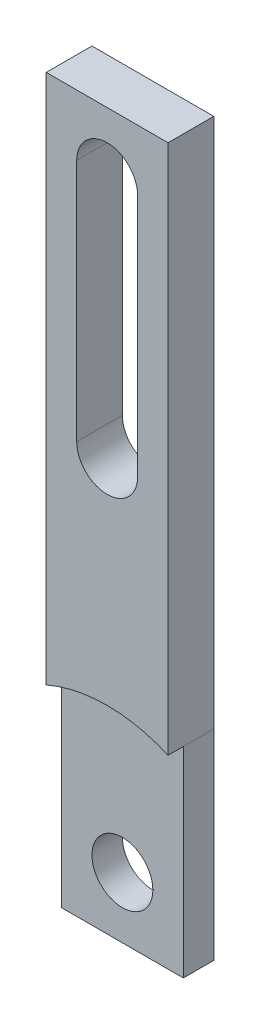
ISO-10303-21;
HEADER;
FILE_DESCRIPTION(('STEP AP214'),'2;1');
FILE_NAME('part.step','',(''),(''),'','','');
FILE_SCHEMA(('AUTOMOTIVE_DESIGN { 1 0 10303 214 1 1 1 1 }'));
ENDSEC;
DATA;
#1=APPLICATION_CONTEXT('core data for automotive mechanical design processes');
#2=APPLICATION_PROTOCOL_DEFINITION('international standard','automotive_design',2000,#1);
#3=PRODUCT_CONTEXT('',#1,'mechanical');
#4=PRODUCT('Part','Part','',(#3));
#5=PRODUCT_RELATED_PRODUCT_CATEGORY('part','',(#4));
#6=PRODUCT_DEFINITION_FORMATION('','',#4);
#7=PRODUCT_DEFINITION_CONTEXT('part definition',#1,'design');
#8=PRODUCT_DEFINITION('design','',#6,#7);
#9=PRODUCT_DEFINITION_SHAPE('','',#8);
#10=(LENGTH_UNIT() NAMED_UNIT(*) SI_UNIT(.MILLI.,.METRE.));
#11=(NAMED_UNIT(*) PLANE_ANGLE_UNIT() SI_UNIT($,.RADIAN.));
#12=(NAMED_UNIT(*) SI_UNIT($,.STERADIAN.) SOLID_ANGLE_UNIT());
#13=UNCERTAINTY_MEASURE_WITH_UNIT(LENGTH_MEASURE(1.E-05),#10,'distance_accuracy_value','');
#14=(GEOMETRIC_REPRESENTATION_CONTEXT(3) GLOBAL_UNCERTAINTY_ASSIGNED_CONTEXT((#13)) GLOBAL_UNIT_ASSIGNED_CONTEXT((#10,
#11,#12)) REPRESENTATION_CONTEXT('',''));
#15=CARTESIAN_POINT('',(0.,0.,0.));
#16=DIRECTION('',(0.,0.,1.));
#17=DIRECTION('',(1.,0.,0.));
#18=AXIS2_PLACEMENT_3D('',#15,#16,#17);
#19=CARTESIAN_POINT('',(0.,-66.6554384955217,-5.));
#20=DIRECTION('',(0.,0.,1.));
#21=DIRECTION('',(1.,0.,0.));
#22=AXIS2_PLACEMENT_3D('',#19,#20,#21);
#23=CYLINDRICAL_SURFACE('',#22,49.9581167848633);
#24=DIRECTION('',(0.,0.,1.));
#25=VECTOR('',#24,1.);
#26=CARTESIAN_POINT('',(20.,-20.8753835295211,-5.));
#27=LINE('',#26,#25);
#28=CARTESIAN_POINT('',(20.,-20.8753835295211,-5.));
#29=VERTEX_POINT('',#28);
#30=CARTESIAN_POINT('',(20.,-20.8753835295211,10.));
#31=VERTEX_POINT('',#30);
#32=EDGE_CURVE('E171',#29,#31,#27,.T.);
#33=ORIENTED_EDGE('',*,*,#32,.T.);
#34=CARTESIAN_POINT('',(0.,-66.6554384955217,10.));
#35=DIRECTION('',(0.,0.,1.));
#36=DIRECTION('',(1.,0.,0.));
#37=AXIS2_PLACEMENT_3D('',#34,#35,#36);
#38=CIRCLE('',#37,49.9581167848633);
#39=CARTESIAN_POINT('',(-20.,-20.8753835295211,10.));
#40=VERTEX_POINT('',#39);
#41=EDGE_CURVE('E142',#31,#40,#38,.T.);
#42=ORIENTED_EDGE('',*,*,#41,.T.);
#43=DIRECTION('',(0.,0.,1.));
#44=VECTOR('',#43,1.);
#45=CARTESIAN_POINT('',(-20.,-20.8753835295211,-5.));
#46=LINE('',#45,#44);
#47=CARTESIAN_POINT('',(-20.,-20.8753835295211,-5.));
#48=VERTEX_POINT('',#47);
#49=EDGE_CURVE('E12',#48,#40,#46,.T.);
#50=ORIENTED_EDGE('',*,*,#49,.F.);
#51=CARTESIAN_POINT('',(0.,-66.6554384955217,-5.));
#52=DIRECTION('',(0.,0.,1.));
#53=DIRECTION('',(1.,0.,0.));
#54=AXIS2_PLACEMENT_3D('',#51,#52,#53);
#55=CIRCLE('',#54,49.9581167848633);
#56=EDGE_CURVE('E165',#29,#48,#55,.T.);
#57=ORIENTED_EDGE('',*,*,#56,.F.);
#58=EDGE_LOOP('',(#33,#42,#50,#57));
#59=FACE_BOUND('',#58,.T.);
#60=ADVANCED_FACE('F51',(#59),#23,.F.);
#61=CARTESIAN_POINT('',(-20.,0.,-5.));
#62=DIRECTION('',(1.,0.,0.));
#63=DIRECTION('',(0.,0.,-1.));
#64=AXIS2_PLACEMENT_3D('',#61,#62,#63);
#65=PLANE('',#64);
#66=ORIENTED_EDGE('',*,*,#49,.T.);
#67=DIRECTION('',(0.,1.,0.));
#68=VECTOR('',#67,1.);
#69=CARTESIAN_POINT('',(-20.,0.,10.));
#70=LINE('',#69,#68);
#71=CARTESIAN_POINT('',(-20.,153.29885952092,10.));
#72=VERTEX_POINT('',#71);
#73=EDGE_CURVE('E151',#40,#72,#70,.T.);
#74=ORIENTED_EDGE('',*,*,#73,.T.);
#75=DIRECTION('',(0.,0.,1.));
#76=VECTOR('',#75,1.);
#77=CARTESIAN_POINT('',(-20.,153.29885952092,-5.));
#78=LINE('',#77,#76);
#79=CARTESIAN_POINT('',(-20.,153.29885952092,-5.));
#80=VERTEX_POINT('',#79);
#81=EDGE_CURVE('E58',#80,#72,#78,.T.);
#82=ORIENTED_EDGE('',*,*,#81,.F.);
#83=DIRECTION('',(0.,1.,0.));
#84=VECTOR('',#83,1.);
#85=CARTESIAN_POINT('',(-20.,0.,-5.));
#86=LINE('',#85,#84);
#87=EDGE_CURVE('E66',#48,#80,#86,.T.);
#88=ORIENTED_EDGE('',*,*,#87,.F.);
#89=EDGE_LOOP('',(#66,#74,#82,#88));
#90=FACE_BOUND('',#89,.T.);
#91=ADVANCED_FACE('F198',(#90),#65,.F.);
#92=CARTESIAN_POINT('',(0.,153.29885952092,-5.));
#93=DIRECTION('',(0.,1.,0.));
#94=DIRECTION('',(0.,0.,1.));
#95=AXIS2_PLACEMENT_3D('',#92,#93,#94);
#96=PLANE('',#95);
#97=ORIENTED_EDGE('',*,*,#81,.T.);
#98=DIRECTION('',(-1.,0.,0.));
#99=VECTOR('',#98,1.);
#100=CARTESIAN_POINT('',(0.,153.29885952092,10.));
#101=LINE('',#100,#99);
#102=CARTESIAN_POINT('',(20.,153.29885952092,10.));
#103=VERTEX_POINT('',#102);
#104=EDGE_CURVE('E146',#103,#72,#101,.T.);
#105=ORIENTED_EDGE('',*,*,#104,.F.);
#106=DIRECTION('',(0.,0.,1.));
#107=VECTOR('',#106,1.);
#108=CARTESIAN_POINT('',(20.,153.29885952092,-5.));
#109=LINE('',#108,#107);
#110=CARTESIAN_POINT('',(20.,153.29885952092,-5.));
#111=VERTEX_POINT('',#110);
#112=EDGE_CURVE('E175',#111,#103,#109,.T.);
#113=ORIENTED_EDGE('',*,*,#112,.F.);
#114=DIRECTION('',(-1.,0.,0.));
#115=VECTOR('',#114,1.);
#116=CARTESIAN_POINT('',(0.,153.29885952092,-5.));
#117=LINE('',#116,#115);
#118=EDGE_CURVE('E170',#111,#80,#117,.T.);
#119=ORIENTED_EDGE('',*,*,#118,.T.);
#120=EDGE_LOOP('',(#97,#105,#113,#119));
#121=FACE_BOUND('',#120,.T.);
#122=ADVANCED_FACE('F199',(#121),#96,.T.);
#123=CARTESIAN_POINT('',(-9.99999999999998,0.,-5.));
#124=DIRECTION('',(-1.,0.,0.));
#125=DIRECTION('',(0.,-1.,0.));
#126=AXIS2_PLACEMENT_3D('',#123,#124,#125);
#127=PLANE('',#126);
#128=DIRECTION('',(0.,0.,1.));
#129=VECTOR('',#128,1.);
#130=CARTESIAN_POINT('',(-10.,133.298859520921,-5.));
#131=LINE('',#130,#129);
#132=CARTESIAN_POINT('',(-10.,133.298859520921,-5.));
#133=VERTEX_POINT('',#132);
#134=CARTESIAN_POINT('',(-10.,133.298859520921,10.));
#135=VERTEX_POINT('',#134);
#136=EDGE_CURVE('E54',#133,#135,#131,.T.);
#137=ORIENTED_EDGE('',*,*,#136,.T.);
#138=DIRECTION('',(0.,-1.,0.));
#139=VECTOR('',#138,1.);
#140=CARTESIAN_POINT('',(-9.99999999999998,0.,10.));
#141=LINE('',#140,#139);
#142=CARTESIAN_POINT('',(-9.99999999999999,53.2988595209205,10.));
#143=VERTEX_POINT('',#142);
#144=EDGE_CURVE('E119',#135,#143,#141,.T.);
#145=ORIENTED_EDGE('',*,*,#144,.T.);
#146=DIRECTION('',(0.,0.,1.));
#147=VECTOR('',#146,1.);
#148=CARTESIAN_POINT('',(-9.99999999999999,53.2988595209205,-5.));
#149=LINE('',#148,#147);
#150=CARTESIAN_POINT('',(-9.99999999999999,53.2988595209205,-5.));
#151=VERTEX_POINT('',#150);
#152=EDGE_CURVE('E179',#151,#143,#149,.T.);
#153=ORIENTED_EDGE('',*,*,#152,.F.);
#154=DIRECTION('',(0.,-1.,0.));
#155=VECTOR('',#154,1.);
#156=CARTESIAN_POINT('',(-9.99999999999998,0.,-5.));
#157=LINE('',#156,#155);
#158=EDGE_CURVE('E124',#133,#151,#157,.T.);
#159=ORIENTED_EDGE('',*,*,#158,.F.);
#160=EDGE_LOOP('',(#137,#145,#153,#159));
#161=FACE_BOUND('',#160,.T.);
#162=ADVANCED_FACE('F52',(#161),#127,.F.);
#163=CARTESIAN_POINT('',(0.,53.2988595209205,-5.));
#164=DIRECTION('',(0.,0.,1.));
#165=DIRECTION('',(1.,0.,0.));
#166=AXIS2_PLACEMENT_3D('',#163,#164,#165);
#167=CYLINDRICAL_SURFACE('',#166,10.);
#168=ORIENTED_EDGE('',*,*,#152,.T.);
#169=CARTESIAN_POINT('',(0.,53.2988595209205,10.));
#170=DIRECTION('',(0.,0.,1.));
#171=DIRECTION('',(1.,0.,0.));
#172=AXIS2_PLACEMENT_3D('',#169,#170,#171);
#173=CIRCLE('',#172,10.);
#174=CARTESIAN_POINT('',(10.,53.2988595209205,10.));
#175=VERTEX_POINT('',#174);
#176=EDGE_CURVE('E134',#143,#175,#173,.T.);
#177=ORIENTED_EDGE('',*,*,#176,.T.);
#178=DIRECTION('',(0.,0.,1.));
#179=VECTOR('',#178,1.);
#180=CARTESIAN_POINT('',(10.,53.2988595209205,-5.));
#181=LINE('',#180,#179);
#182=CARTESIAN_POINT('',(10.,53.2988595209205,-5.));
#183=VERTEX_POINT('',#182);
#184=EDGE_CURVE('E180',#183,#175,#181,.T.);
#185=ORIENTED_EDGE('',*,*,#184,.F.);
#186=CARTESIAN_POINT('',(0.,53.2988595209205,-5.));
#187=DIRECTION('',(0.,0.,1.));
#188=DIRECTION('',(1.,0.,0.));
#189=AXIS2_PLACEMENT_3D('',#186,#187,#188);
#190=CIRCLE('',#189,10.);
#191=EDGE_CURVE('E159',#151,#183,#190,.T.);
#192=ORIENTED_EDGE('',*,*,#191,.F.);
#193=EDGE_LOOP('',(#168,#177,#185,#192));
#194=FACE_BOUND('',#193,.T.);
#195=ADVANCED_FACE('F184',(#194),#167,.F.);
#196=CARTESIAN_POINT('',(10.,0.,-5.));
#197=DIRECTION('',(-1.,0.,0.));
#198=DIRECTION('',(0.,0.,1.));
#199=AXIS2_PLACEMENT_3D('',#196,#197,#198);
#200=PLANE('',#199);
#201=ORIENTED_EDGE('',*,*,#184,.T.);
#202=DIRECTION('',(0.,-1.,0.));
#203=VECTOR('',#202,1.);
#204=CARTESIAN_POINT('',(10.,0.,10.));
#205=LINE('',#204,#203);
#206=CARTESIAN_POINT('',(10.,133.298859520921,10.));
#207=VERTEX_POINT('',#206);
#208=EDGE_CURVE('E136',#207,#175,#205,.T.);
#209=ORIENTED_EDGE('',*,*,#208,.F.);
#210=DIRECTION('',(0.,0.,1.));
#211=VECTOR('',#210,1.);
#212=CARTESIAN_POINT('',(10.,133.298859520921,-5.));
#213=LINE('',#212,#211);
#214=CARTESIAN_POINT('',(10.,133.298859520921,-5.));
#215=VERTEX_POINT('',#214);
#216=EDGE_CURVE('E122',#215,#207,#213,.T.);
#217=ORIENTED_EDGE('',*,*,#216,.F.);
#218=DIRECTION('',(0.,-1.,0.));
#219=VECTOR('',#218,1.);
#220=CARTESIAN_POINT('',(10.,0.,-5.));
#221=LINE('',#220,#219);
#222=EDGE_CURVE('E160',#215,#183,#221,.T.);
#223=ORIENTED_EDGE('',*,*,#222,.T.);
#224=EDGE_LOOP('',(#201,#209,#217,#223));
#225=FACE_BOUND('',#224,.T.);
#226=ADVANCED_FACE('F182',(#225),#200,.T.);
#227=CARTESIAN_POINT('',(0.,133.298859520921,-5.));
#228=DIRECTION('',(0.,0.,1.));
#229=DIRECTION('',(1.,0.,0.));
#230=AXIS2_PLACEMENT_3D('',#227,#228,#229);
#231=CYLINDRICAL_SURFACE('',#230,10.);
#232=ORIENTED_EDGE('',*,*,#216,.T.);
#233=CARTESIAN_POINT('',(0.,133.298859520921,10.));
#234=DIRECTION('',(0.,0.,1.));
#235=DIRECTION('',(1.,0.,0.));
#236=AXIS2_PLACEMENT_3D('',#233,#234,#235);
#237=CIRCLE('',#236,10.);
#238=EDGE_CURVE('E132',#207,#135,#237,.T.);
#239=ORIENTED_EDGE('',*,*,#238,.T.);
#240=ORIENTED_EDGE('',*,*,#136,.F.);
#241=CARTESIAN_POINT('',(0.,133.298859520921,-5.));
#242=DIRECTION('',(0.,0.,1.));
#243=DIRECTION('',(1.,0.,0.));
#244=AXIS2_PLACEMENT_3D('',#241,#242,#243);
#245=CIRCLE('',#244,10.);
#246=EDGE_CURVE('E154',#215,#133,#245,.T.);
#247=ORIENTED_EDGE('',*,*,#246,.F.);
#248=EDGE_LOOP('',(#232,#239,#240,#247));
#249=FACE_BOUND('',#248,.T.);
#250=ADVANCED_FACE('F133',(#249),#231,.F.);
#251=CARTESIAN_POINT('',(20.,0.,-5.));
#252=DIRECTION('',(1.,0.,0.));
#253=DIRECTION('',(0.,0.,-1.));
#254=AXIS2_PLACEMENT_3D('',#251,#252,#253);
#255=PLANE('',#254);
#256=ORIENTED_EDGE('',*,*,#112,.T.);
#257=DIRECTION('',(0.,1.,0.));
#258=VECTOR('',#257,1.);
#259=CARTESIAN_POINT('',(20.,0.,10.));
#260=LINE('',#259,#258);
#261=EDGE_CURVE('E144',#31,#103,#260,.T.);
#262=ORIENTED_EDGE('',*,*,#261,.F.);
#263=ORIENTED_EDGE('',*,*,#32,.F.);
#264=DIRECTION('',(0.,1.,0.));
#265=VECTOR('',#264,1.);
#266=CARTESIAN_POINT('',(20.,0.,-5.));
#267=LINE('',#266,#265);
#268=EDGE_CURVE('E163',#29,#111,#267,.T.);
#269=ORIENTED_EDGE('',*,*,#268,.T.);
#270=EDGE_LOOP('',(#256,#262,#263,#269));
#271=FACE_BOUND('',#270,.T.);
#272=ADVANCED_FACE('F189',(#271),#255,.T.);
#273=CARTESIAN_POINT('',(0.,0.,-5.));
#274=DIRECTION('',(0.,0.,1.));
#275=DIRECTION('',(1.,0.,0.));
#276=AXIS2_PLACEMENT_3D('',#273,#274,#275);
#277=PLANE('',#276);
#278=ORIENTED_EDGE('',*,*,#158,.T.);
#279=ORIENTED_EDGE('',*,*,#191,.T.);
#280=ORIENTED_EDGE('',*,*,#222,.F.);
#281=ORIENTED_EDGE('',*,*,#246,.T.);
#282=EDGE_LOOP('',(#278,#279,#280,#281));
#283=FACE_BOUND('',#282,.T.);
#284=ORIENTED_EDGE('',*,*,#56,.T.);
#285=ORIENTED_EDGE('',*,*,#87,.T.);
#286=ORIENTED_EDGE('',*,*,#118,.F.);
#287=ORIENTED_EDGE('',*,*,#268,.F.);
#288=EDGE_LOOP('',(#284,#285,#286,#287));
#289=FACE_BOUND('',#288,.T.);
#290=ADVANCED_FACE('F187',(#283,#289),#277,.F.);
#291=CARTESIAN_POINT('',(0.,0.,10.));
#292=DIRECTION('',(0.,0.,1.));
#293=DIRECTION('',(1.,0.,0.));
#294=AXIS2_PLACEMENT_3D('',#291,#292,#293);
#295=PLANE('',#294);
#296=ORIENTED_EDGE('',*,*,#144,.F.);
#297=ORIENTED_EDGE('',*,*,#238,.F.);
#298=ORIENTED_EDGE('',*,*,#208,.T.);
#299=ORIENTED_EDGE('',*,*,#176,.F.);
#300=EDGE_LOOP('',(#296,#297,#298,#299));
#301=FACE_BOUND('',#300,.T.);
#302=ORIENTED_EDGE('',*,*,#41,.F.);
#303=ORIENTED_EDGE('',*,*,#261,.T.);
#304=ORIENTED_EDGE('',*,*,#104,.T.);
#305=ORIENTED_EDGE('',*,*,#73,.F.);
#306=EDGE_LOOP('',(#302,#303,#304,#305));
#307=FACE_BOUND('',#306,.T.);
#308=ADVANCED_FACE('F126',(#301,#307),#295,.T.);
#309=CLOSED_SHELL('',(#60,#91,#122,#162,#195,#226,#250,#272,#290,#308));
#310=MANIFOLD_SOLID_BREP('B2',#309);
#311=CARTESIAN_POINT('',(-20.,-86.7011404790795,-5.));
#312=DIRECTION('',(-1.,0.,0.));
#313=DIRECTION('',(0.,0.,1.));
#314=AXIS2_PLACEMENT_3D('',#311,#312,#313);
#315=PLANE('',#314);
#316=DIRECTION('',(0.,0.,1.));
#317=VECTOR('',#316,1.);
#318=CARTESIAN_POINT('',(-20.,-86.7011404790795,-5.));
#319=LINE('',#318,#317);
#320=CARTESIAN_POINT('',(-20.,-86.7011404790795,-5.));
#321=VERTEX_POINT('',#320);
#322=CARTESIAN_POINT('',(-20.,-86.7011404790795,5.));
#323=VERTEX_POINT('',#322);
#324=EDGE_CURVE('E287',#321,#323,#319,.T.);
#325=ORIENTED_EDGE('',*,*,#324,.T.);
#326=DIRECTION('',(0.,-1.,0.));
#327=VECTOR('',#326,1.);
#328=CARTESIAN_POINT('',(-20.,-86.7011404790795,5.));
#329=LINE('',#328,#327);
#330=CARTESIAN_POINT('',(-20.,-20.8753835295211,5.));
#331=VERTEX_POINT('',#330);
#332=EDGE_CURVE('E330',#331,#323,#329,.T.);
#333=ORIENTED_EDGE('',*,*,#332,.F.);
#334=DIRECTION('',(0.,0.,1.));
#335=VECTOR('',#334,1.);
#336=CARTESIAN_POINT('',(-20.,-20.8753835295211,-5.));
#337=LINE('',#336,#335);
#338=CARTESIAN_POINT('',(-20.,-20.8753835295211,-5.));
#339=VERTEX_POINT('',#338);
#340=EDGE_CURVE('E47',#339,#331,#337,.T.);
#341=ORIENTED_EDGE('',*,*,#340,.F.);
#342=DIRECTION('',(0.,-1.,0.));
#343=VECTOR('',#342,1.);
#344=CARTESIAN_POINT('',(-20.,-86.7011404790795,-5.));
#345=LINE('',#344,#343);
#346=EDGE_CURVE('E327',#339,#321,#345,.T.);
#347=ORIENTED_EDGE('',*,*,#346,.T.);
#348=EDGE_LOOP('',(#325,#333,#341,#347));
#349=FACE_BOUND('',#348,.T.);
#350=ADVANCED_FACE('F286',(#349),#315,.T.);
#351=CARTESIAN_POINT('',(0.,-66.7011404790795,-5.));
#352=DIRECTION('',(0.,0.,1.));
#353=DIRECTION('',(1.,0.,0.));
#354=AXIS2_PLACEMENT_3D('',#351,#352,#353);
#355=CYLINDRICAL_SURFACE('',#354,50.);
#356=ORIENTED_EDGE('',*,*,#340,.T.);
#357=CARTESIAN_POINT('',(0.,-66.7011404790795,5.));
#358=DIRECTION('',(0.,0.,1.));
#359=DIRECTION('',(1.,0.,0.));
#360=AXIS2_PLACEMENT_3D('',#357,#358,#359);
#361=CIRCLE('',#360,50.);
#362=CARTESIAN_POINT('',(20.,-20.8753835295211,5.));
#363=VERTEX_POINT('',#362);
#364=EDGE_CURVE('E342',#363,#331,#361,.T.);
#365=ORIENTED_EDGE('',*,*,#364,.F.);
#366=DIRECTION('',(0.,0.,1.));
#367=VECTOR('',#366,1.);
#368=CARTESIAN_POINT('',(20.,-20.8753835295211,-5.));
#369=LINE('',#368,#367);
#370=CARTESIAN_POINT('',(20.,-20.8753835295211,-5.));
#371=VERTEX_POINT('',#370);
#372=EDGE_CURVE('E293',#371,#363,#369,.T.);
#373=ORIENTED_EDGE('',*,*,#372,.F.);
#374=CARTESIAN_POINT('',(0.,-66.7011404790795,-5.));
#375=DIRECTION('',(0.,0.,1.));
#376=DIRECTION('',(1.,0.,0.));
#377=AXIS2_PLACEMENT_3D('',#374,#375,#376);
#378=CIRCLE('',#377,50.);
#379=EDGE_CURVE('E334',#371,#339,#378,.T.);
#380=ORIENTED_EDGE('',*,*,#379,.T.);
#381=EDGE_LOOP('',(#356,#365,#373,#380));
#382=FACE_BOUND('',#381,.T.);
#383=ADVANCED_FACE('F368',(#382),#355,.T.);
#384=CARTESIAN_POINT('',(20.,-86.7011404790795,-5.));
#385=DIRECTION('',(1.,0.,0.));
#386=DIRECTION('',(0.,0.,-1.));
#387=AXIS2_PLACEMENT_3D('',#384,#385,#386);
#388=PLANE('',#387);
#389=ORIENTED_EDGE('',*,*,#372,.T.);
#390=DIRECTION('',(0.,1.,0.));
#391=VECTOR('',#390,1.);
#392=CARTESIAN_POINT('',(20.,-86.7011404790795,5.));
#393=LINE('',#392,#391);
#394=CARTESIAN_POINT('',(20.,-86.7011404790795,5.));
#395=VERTEX_POINT('',#394);
#396=EDGE_CURVE('E338',#395,#363,#393,.T.);
#397=ORIENTED_EDGE('',*,*,#396,.F.);
#398=DIRECTION('',(0.,0.,1.));
#399=VECTOR('',#398,1.);
#400=CARTESIAN_POINT('',(20.,-86.7011404790795,-5.));
#401=LINE('',#400,#399);
#402=CARTESIAN_POINT('',(20.,-86.7011404790795,-5.));
#403=VERTEX_POINT('',#402);
#404=EDGE_CURVE('E335',#403,#395,#401,.T.);
#405=ORIENTED_EDGE('',*,*,#404,.F.);
#406=DIRECTION('',(0.,1.,0.));
#407=VECTOR('',#406,1.);
#408=CARTESIAN_POINT('',(20.,-86.7011404790795,-5.));
#409=LINE('',#408,#407);
#410=EDGE_CURVE('E358',#403,#371,#409,.T.);
#411=ORIENTED_EDGE('',*,*,#410,.T.);
#412=EDGE_LOOP('',(#389,#397,#405,#411));
#413=FACE_BOUND('',#412,.T.);
#414=ADVANCED_FACE('F361',(#413),#388,.T.);
#415=CARTESIAN_POINT('',(-20.,-86.7011404790795,-5.));
#416=DIRECTION('',(0.,-1.,0.));
#417=DIRECTION('',(0.,0.,-1.));
#418=AXIS2_PLACEMENT_3D('',#415,#416,#417);
#419=PLANE('',#418);
#420=ORIENTED_EDGE('',*,*,#404,.T.);
#421=DIRECTION('',(1.,0.,0.));
#422=VECTOR('',#421,1.);
#423=CARTESIAN_POINT('',(-20.,-86.7011404790795,5.));
#424=LINE('',#423,#422);
#425=EDGE_CURVE('E333',#323,#395,#424,.T.);
#426=ORIENTED_EDGE('',*,*,#425,.F.);
#427=ORIENTED_EDGE('',*,*,#324,.F.);
#428=DIRECTION('',(1.,0.,0.));
#429=VECTOR('',#428,1.);
#430=CARTESIAN_POINT('',(-20.,-86.7011404790795,-5.));
#431=LINE('',#430,#429);
#432=EDGE_CURVE('E356',#321,#403,#431,.T.);
#433=ORIENTED_EDGE('',*,*,#432,.T.);
#434=EDGE_LOOP('',(#420,#426,#427,#433));
#435=FACE_BOUND('',#434,.T.);
#436=ADVANCED_FACE('F337',(#435),#419,.T.);
#437=CARTESIAN_POINT('',(0.,-66.7011404790795,-5.));
#438=DIRECTION('',(0.,0.,1.));
#439=DIRECTION('',(1.,0.,0.));
#440=AXIS2_PLACEMENT_3D('',#437,#438,#439);
#441=PLANE('',#440);
#442=CARTESIAN_POINT('',(0.,-66.7011404790795,-5.));
#443=DIRECTION('',(0.,0.,1.));
#444=DIRECTION('',(1.,0.,0.));
#445=AXIS2_PLACEMENT_3D('',#442,#443,#444);
#446=CIRCLE('',#445,10.);
#447=CARTESIAN_POINT('',(10.,-66.7011404790795,-5.));
#448=VERTEX_POINT('',#447);
#449=EDGE_CURVE('E354',#448,#448,#446,.T.);
#450=ORIENTED_EDGE('',*,*,#449,.T.);
#451=EDGE_LOOP('',(#450));
#452=FACE_BOUND('',#451,.T.);
#453=ORIENTED_EDGE('',*,*,#346,.F.);
#454=ORIENTED_EDGE('',*,*,#379,.F.);
#455=ORIENTED_EDGE('',*,*,#410,.F.);
#456=ORIENTED_EDGE('',*,*,#432,.F.);
#457=EDGE_LOOP('',(#453,#454,#455,#456));
#458=FACE_BOUND('',#457,.T.);
#459=ADVANCED_FACE('F366',(#452,#458),#441,.F.);
#460=CARTESIAN_POINT('',(0.,-66.7011404790795,-5.));
#461=DIRECTION('',(0.,0.,1.));
#462=DIRECTION('',(1.,0.,0.));
#463=AXIS2_PLACEMENT_3D('',#460,#461,#462);
#464=CYLINDRICAL_SURFACE('',#463,10.);
#465=ORIENTED_EDGE('',*,*,#449,.F.);
#466=EDGE_LOOP('',(#465));
#467=FACE_BOUND('',#466,.T.);
#468=CARTESIAN_POINT('',(0.,-66.7011404790795,5.));
#469=DIRECTION('',(0.,0.,1.));
#470=DIRECTION('',(1.,0.,0.));
#471=AXIS2_PLACEMENT_3D('',#468,#469,#470);
#472=CIRCLE('',#471,10.);
#473=CARTESIAN_POINT('',(10.,-66.7011404790795,5.));
#474=VERTEX_POINT('',#473);
#475=EDGE_CURVE('E347',#474,#474,#472,.T.);
#476=ORIENTED_EDGE('',*,*,#475,.T.);
#477=EDGE_LOOP('',(#476));
#478=FACE_BOUND('',#477,.T.);
#479=ADVANCED_FACE('F367',(#467,#478),#464,.F.);
#480=CARTESIAN_POINT('',(0.,-66.7011404790795,5.));
#481=DIRECTION('',(0.,0.,1.));
#482=DIRECTION('',(1.,0.,0.));
#483=AXIS2_PLACEMENT_3D('',#480,#481,#482);
#484=PLANE('',#483);
#485=ORIENTED_EDGE('',*,*,#332,.T.);
#486=ORIENTED_EDGE('',*,*,#425,.T.);
#487=ORIENTED_EDGE('',*,*,#396,.T.);
#488=ORIENTED_EDGE('',*,*,#364,.T.);
#489=EDGE_LOOP('',(#485,#486,#487,#488));
#490=FACE_BOUND('',#489,.T.);
#491=ORIENTED_EDGE('',*,*,#475,.F.);
#492=EDGE_LOOP('',(#491));
#493=FACE_BOUND('',#492,.T.);
#494=ADVANCED_FACE('F345',(#490,#493),#484,.T.);
#495=CLOSED_SHELL('',(#350,#383,#414,#436,#459,#479,#494));
#496=MANIFOLD_SOLID_BREP('B6',#495);
#497=ADVANCED_BREP_SHAPE_REPRESENTATION('',(#18,#310,#496),#14);
#498=SHAPE_DEFINITION_REPRESENTATION(#9,#497);
ENDSEC;
END-ISO-10303-21;
